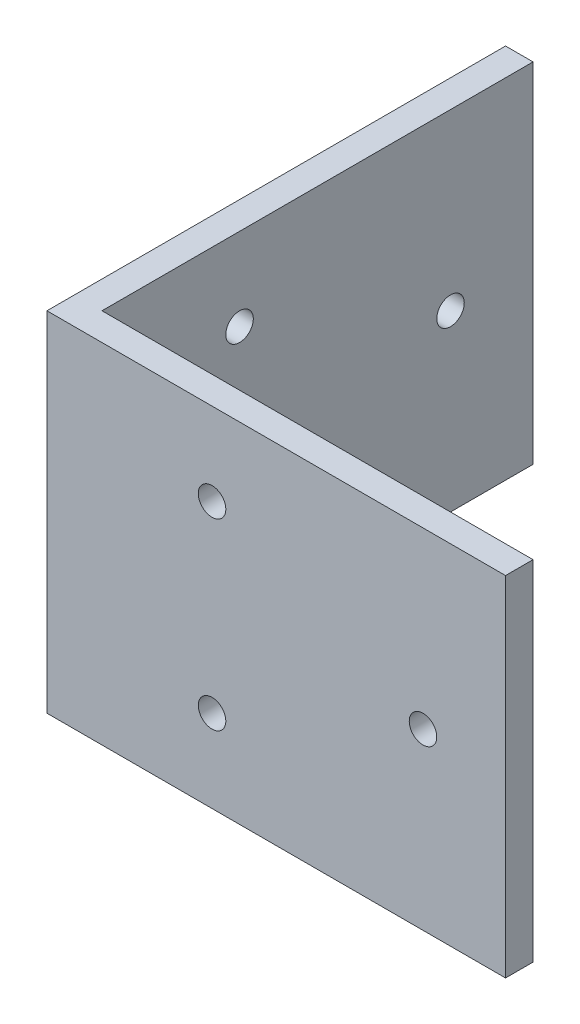
ISO-10303-21;
HEADER;
FILE_DESCRIPTION(('STEP AP214'),'2;1');
FILE_NAME('part.step','',(''),(''),'','','');
FILE_SCHEMA(('AUTOMOTIVE_DESIGN { 1 0 10303 214 1 1 1 1 }'));
ENDSEC;
DATA;
#1=APPLICATION_CONTEXT('core data for automotive mechanical design processes');
#2=APPLICATION_PROTOCOL_DEFINITION('international standard','automotive_design',2000,#1);
#3=PRODUCT_CONTEXT('',#1,'mechanical');
#4=PRODUCT('Part','Part','',(#3));
#5=PRODUCT_RELATED_PRODUCT_CATEGORY('part','',(#4));
#6=PRODUCT_DEFINITION_FORMATION('','',#4);
#7=PRODUCT_DEFINITION_CONTEXT('part definition',#1,'design');
#8=PRODUCT_DEFINITION('design','',#6,#7);
#9=PRODUCT_DEFINITION_SHAPE('','',#8);
#10=(LENGTH_UNIT() NAMED_UNIT(*) SI_UNIT(.MILLI.,.METRE.));
#11=(NAMED_UNIT(*) PLANE_ANGLE_UNIT() SI_UNIT($,.RADIAN.));
#12=(NAMED_UNIT(*) SI_UNIT($,.STERADIAN.) SOLID_ANGLE_UNIT());
#13=UNCERTAINTY_MEASURE_WITH_UNIT(LENGTH_MEASURE(1.E-05),#10,'distance_accuracy_value','');
#14=(GEOMETRIC_REPRESENTATION_CONTEXT(3) GLOBAL_UNCERTAINTY_ASSIGNED_CONTEXT((#13)) GLOBAL_UNIT_ASSIGNED_CONTEXT((#10,
#11,#12)) REPRESENTATION_CONTEXT('',''));
#15=CARTESIAN_POINT('',(0.,0.,0.));
#16=DIRECTION('',(0.,0.,1.));
#17=DIRECTION('',(1.,0.,0.));
#18=AXIS2_PLACEMENT_3D('',#15,#16,#17);
#19=CARTESIAN_POINT('',(3.,38.,0.));
#20=DIRECTION('',(0.,0.,1.));
#21=DIRECTION('',(1.,0.,0.));
#22=AXIS2_PLACEMENT_3D('',#19,#20,#21);
#23=PLANE('',#22);
#24=DIRECTION('',(-1.,0.,0.));
#25=VECTOR('',#24,1.);
#26=CARTESIAN_POINT('',(3.,0.,0.));
#27=LINE('',#26,#25);
#28=CARTESIAN_POINT('',(3.,0.,0.));
#29=VERTEX_POINT('',#28);
#30=CARTESIAN_POINT('',(0.,0.,0.));
#31=VERTEX_POINT('',#30);
#32=EDGE_CURVE('E118',#29,#31,#27,.T.);
#33=ORIENTED_EDGE('',*,*,#32,.T.);
#34=DIRECTION('',(0.,-1.,0.));
#35=VECTOR('',#34,1.);
#36=CARTESIAN_POINT('',(0.,38.,0.));
#37=LINE('',#36,#35);
#38=CARTESIAN_POINT('',(0.,38.,0.));
#39=VERTEX_POINT('',#38);
#40=EDGE_CURVE('E11',#39,#31,#37,.T.);
#41=ORIENTED_EDGE('',*,*,#40,.F.);
#42=DIRECTION('',(-1.,0.,0.));
#43=VECTOR('',#42,1.);
#44=CARTESIAN_POINT('',(3.,38.,0.));
#45=LINE('',#44,#43);
#46=CARTESIAN_POINT('',(3.,38.,0.));
#47=VERTEX_POINT('',#46);
#48=EDGE_CURVE('E129',#47,#39,#45,.T.);
#49=ORIENTED_EDGE('',*,*,#48,.F.);
#50=DIRECTION('',(0.,-1.,0.));
#51=VECTOR('',#50,1.);
#52=CARTESIAN_POINT('',(3.,38.,0.));
#53=LINE('',#52,#51);
#54=EDGE_CURVE('E114',#47,#29,#53,.T.);
#55=ORIENTED_EDGE('',*,*,#54,.T.);
#56=EDGE_LOOP('',(#33,#41,#49,#55));
#57=FACE_BOUND('',#56,.T.);
#58=ADVANCED_FACE('F34',(#57),#23,.F.);
#59=CARTESIAN_POINT('',(0.,38.,0.));
#60=DIRECTION('',(1.,0.,0.));
#61=DIRECTION('',(0.,0.,-1.));
#62=AXIS2_PLACEMENT_3D('',#59,#60,#61);
#63=PLANE('',#62);
#64=CARTESIAN_POINT('',(0.,19.,9.00000000000001));
#65=DIRECTION('',(1.,0.,0.));
#66=DIRECTION('',(0.,0.,-1.));
#67=AXIS2_PLACEMENT_3D('',#64,#65,#66);
#68=CIRCLE('',#67,1.5);
#69=CARTESIAN_POINT('',(0.,19.,7.50000000000001));
#70=VERTEX_POINT('',#69);
#71=EDGE_CURVE('E294',#70,#70,#68,.T.);
#72=ORIENTED_EDGE('',*,*,#71,.T.);
#73=EDGE_LOOP('',(#72));
#74=FACE_BOUND('',#73,.T.);
#75=CARTESIAN_POINT('',(0.,9.,32.));
#76=DIRECTION('',(1.,0.,0.));
#77=DIRECTION('',(0.,0.,-1.));
#78=AXIS2_PLACEMENT_3D('',#75,#76,#77);
#79=CIRCLE('',#78,1.5);
#80=CARTESIAN_POINT('',(0.,9.,30.5));
#81=VERTEX_POINT('',#80);
#82=EDGE_CURVE('E284',#81,#81,#79,.T.);
#83=ORIENTED_EDGE('',*,*,#82,.T.);
#84=EDGE_LOOP('',(#83));
#85=FACE_BOUND('',#84,.T.);
#86=CARTESIAN_POINT('',(0.,29.,32.));
#87=DIRECTION('',(1.,0.,0.));
#88=DIRECTION('',(0.,0.,-1.));
#89=AXIS2_PLACEMENT_3D('',#86,#87,#88);
#90=CIRCLE('',#89,1.5);
#91=CARTESIAN_POINT('',(0.,29.,30.5));
#92=VERTEX_POINT('',#91);
#93=EDGE_CURVE('E122',#92,#92,#90,.T.);
#94=ORIENTED_EDGE('',*,*,#93,.T.);
#95=EDGE_LOOP('',(#94));
#96=FACE_BOUND('',#95,.T.);
#97=DIRECTION('',(0.,0.,1.));
#98=VECTOR('',#97,1.);
#99=CARTESIAN_POINT('',(0.,0.,0.));
#100=LINE('',#99,#98);
#101=CARTESIAN_POINT('',(0.,0.,50.));
#102=VERTEX_POINT('',#101);
#103=EDGE_CURVE('E121',#31,#102,#100,.T.);
#104=ORIENTED_EDGE('',*,*,#103,.T.);
#105=DIRECTION('',(0.,-1.,0.));
#106=VECTOR('',#105,1.);
#107=CARTESIAN_POINT('',(0.,38.,50.));
#108=LINE('',#107,#106);
#109=CARTESIAN_POINT('',(0.,38.,50.));
#110=VERTEX_POINT('',#109);
#111=EDGE_CURVE('E42',#110,#102,#108,.T.);
#112=ORIENTED_EDGE('',*,*,#111,.F.);
#113=DIRECTION('',(0.,0.,1.));
#114=VECTOR('',#113,1.);
#115=CARTESIAN_POINT('',(0.,38.,0.));
#116=LINE('',#115,#114);
#117=EDGE_CURVE('E87',#39,#110,#116,.T.);
#118=ORIENTED_EDGE('',*,*,#117,.F.);
#119=ORIENTED_EDGE('',*,*,#40,.T.);
#120=EDGE_LOOP('',(#104,#112,#118,#119));
#121=FACE_BOUND('',#120,.T.);
#122=ADVANCED_FACE('F157',(#74,#85,#96,#121),#63,.F.);
#123=CARTESIAN_POINT('',(0.,38.,50.));
#124=DIRECTION('',(0.,0.,-1.));
#125=DIRECTION('',(-1.,0.,0.));
#126=AXIS2_PLACEMENT_3D('',#123,#124,#125);
#127=PLANE('',#126);
#128=CARTESIAN_POINT('',(41.,19.,50.));
#129=DIRECTION('',(0.,0.,-1.));
#130=DIRECTION('',(-1.,0.,0.));
#131=AXIS2_PLACEMENT_3D('',#128,#129,#130);
#132=CIRCLE('',#131,1.5);
#133=CARTESIAN_POINT('',(39.5,19.,50.));
#134=VERTEX_POINT('',#133);
#135=EDGE_CURVE('E311',#134,#134,#132,.T.);
#136=ORIENTED_EDGE('',*,*,#135,.T.);
#137=EDGE_LOOP('',(#136));
#138=FACE_BOUND('',#137,.T.);
#139=CARTESIAN_POINT('',(18.,9.,50.));
#140=DIRECTION('',(0.,0.,-1.));
#141=DIRECTION('',(-1.,0.,0.));
#142=AXIS2_PLACEMENT_3D('',#139,#140,#141);
#143=CIRCLE('',#142,1.5);
#144=CARTESIAN_POINT('',(16.5,9.,50.));
#145=VERTEX_POINT('',#144);
#146=EDGE_CURVE('E305',#145,#145,#143,.T.);
#147=ORIENTED_EDGE('',*,*,#146,.T.);
#148=EDGE_LOOP('',(#147));
#149=FACE_BOUND('',#148,.T.);
#150=CARTESIAN_POINT('',(18.,29.,50.));
#151=DIRECTION('',(0.,0.,-1.));
#152=DIRECTION('',(-1.,0.,0.));
#153=AXIS2_PLACEMENT_3D('',#150,#151,#152);
#154=CIRCLE('',#153,1.5);
#155=CARTESIAN_POINT('',(16.5,29.,50.));
#156=VERTEX_POINT('',#155);
#157=EDGE_CURVE('E299',#156,#156,#154,.T.);
#158=ORIENTED_EDGE('',*,*,#157,.T.);
#159=EDGE_LOOP('',(#158));
#160=FACE_BOUND('',#159,.T.);
#161=DIRECTION('',(1.,0.,0.));
#162=VECTOR('',#161,1.);
#163=CARTESIAN_POINT('',(0.,0.,50.));
#164=LINE('',#163,#162);
#165=CARTESIAN_POINT('',(50.,0.,50.));
#166=VERTEX_POINT('',#165);
#167=EDGE_CURVE('E124',#102,#166,#164,.T.);
#168=ORIENTED_EDGE('',*,*,#167,.T.);
#169=DIRECTION('',(0.,-1.,0.));
#170=VECTOR('',#169,1.);
#171=CARTESIAN_POINT('',(50.,38.,50.));
#172=LINE('',#171,#170);
#173=CARTESIAN_POINT('',(50.,38.,50.));
#174=VERTEX_POINT('',#173);
#175=EDGE_CURVE('E109',#174,#166,#172,.T.);
#176=ORIENTED_EDGE('',*,*,#175,.F.);
#177=DIRECTION('',(1.,0.,0.));
#178=VECTOR('',#177,1.);
#179=CARTESIAN_POINT('',(0.,38.,50.));
#180=LINE('',#179,#178);
#181=EDGE_CURVE('E100',#110,#174,#180,.T.);
#182=ORIENTED_EDGE('',*,*,#181,.F.);
#183=ORIENTED_EDGE('',*,*,#111,.T.);
#184=EDGE_LOOP('',(#168,#176,#182,#183));
#185=FACE_BOUND('',#184,.T.);
#186=ADVANCED_FACE('F135',(#138,#149,#160,#185),#127,.F.);
#187=CARTESIAN_POINT('',(50.,38.,50.));
#188=DIRECTION('',(-1.,0.,0.));
#189=DIRECTION('',(0.,0.,1.));
#190=AXIS2_PLACEMENT_3D('',#187,#188,#189);
#191=PLANE('',#190);
#192=DIRECTION('',(0.,0.,-1.));
#193=VECTOR('',#192,1.);
#194=CARTESIAN_POINT('',(50.,0.,50.));
#195=LINE('',#194,#193);
#196=CARTESIAN_POINT('',(50.,0.,47.));
#197=VERTEX_POINT('',#196);
#198=EDGE_CURVE('E108',#166,#197,#195,.T.);
#199=ORIENTED_EDGE('',*,*,#198,.T.);
#200=DIRECTION('',(0.,-1.,0.));
#201=VECTOR('',#200,1.);
#202=CARTESIAN_POINT('',(50.,38.,47.));
#203=LINE('',#202,#201);
#204=CARTESIAN_POINT('',(50.,38.,47.));
#205=VERTEX_POINT('',#204);
#206=EDGE_CURVE('E105',#205,#197,#203,.T.);
#207=ORIENTED_EDGE('',*,*,#206,.F.);
#208=DIRECTION('',(0.,0.,-1.));
#209=VECTOR('',#208,1.);
#210=CARTESIAN_POINT('',(50.,38.,50.));
#211=LINE('',#210,#209);
#212=EDGE_CURVE('E94',#174,#205,#211,.T.);
#213=ORIENTED_EDGE('',*,*,#212,.F.);
#214=ORIENTED_EDGE('',*,*,#175,.T.);
#215=EDGE_LOOP('',(#199,#207,#213,#214));
#216=FACE_BOUND('',#215,.T.);
#217=ADVANCED_FACE('F106',(#216),#191,.F.);
#218=CARTESIAN_POINT('',(50.,38.,47.));
#219=DIRECTION('',(0.,0.,1.));
#220=DIRECTION('',(1.,0.,0.));
#221=AXIS2_PLACEMENT_3D('',#218,#219,#220);
#222=PLANE('',#221);
#223=CARTESIAN_POINT('',(41.,19.,47.));
#224=DIRECTION('',(0.,0.,-1.));
#225=DIRECTION('',(-1.,0.,0.));
#226=AXIS2_PLACEMENT_3D('',#223,#224,#225);
#227=CIRCLE('',#226,1.5);
#228=CARTESIAN_POINT('',(39.5,19.,47.));
#229=VERTEX_POINT('',#228);
#230=EDGE_CURVE('E314',#229,#229,#227,.T.);
#231=ORIENTED_EDGE('',*,*,#230,.F.);
#232=EDGE_LOOP('',(#231));
#233=FACE_BOUND('',#232,.T.);
#234=CARTESIAN_POINT('',(18.,9.,47.));
#235=DIRECTION('',(0.,0.,-1.));
#236=DIRECTION('',(-1.,0.,0.));
#237=AXIS2_PLACEMENT_3D('',#234,#235,#236);
#238=CIRCLE('',#237,1.5);
#239=CARTESIAN_POINT('',(16.5,9.,47.));
#240=VERTEX_POINT('',#239);
#241=EDGE_CURVE('E308',#240,#240,#238,.T.);
#242=ORIENTED_EDGE('',*,*,#241,.F.);
#243=EDGE_LOOP('',(#242));
#244=FACE_BOUND('',#243,.T.);
#245=CARTESIAN_POINT('',(18.,29.,47.));
#246=DIRECTION('',(0.,0.,-1.));
#247=DIRECTION('',(-1.,0.,0.));
#248=AXIS2_PLACEMENT_3D('',#245,#246,#247);
#249=CIRCLE('',#248,1.5);
#250=CARTESIAN_POINT('',(16.5,29.,47.));
#251=VERTEX_POINT('',#250);
#252=EDGE_CURVE('E302',#251,#251,#249,.T.);
#253=ORIENTED_EDGE('',*,*,#252,.F.);
#254=EDGE_LOOP('',(#253));
#255=FACE_BOUND('',#254,.T.);
#256=DIRECTION('',(-1.,0.,0.));
#257=VECTOR('',#256,1.);
#258=CARTESIAN_POINT('',(50.,0.,47.));
#259=LINE('',#258,#257);
#260=CARTESIAN_POINT('',(3.,0.,47.));
#261=VERTEX_POINT('',#260);
#262=EDGE_CURVE('E73',#197,#261,#259,.T.);
#263=ORIENTED_EDGE('',*,*,#262,.T.);
#264=DIRECTION('',(0.,-1.,0.));
#265=VECTOR('',#264,1.);
#266=CARTESIAN_POINT('',(3.,38.,47.));
#267=LINE('',#266,#265);
#268=CARTESIAN_POINT('',(3.,38.,47.));
#269=VERTEX_POINT('',#268);
#270=EDGE_CURVE('E110',#269,#261,#267,.T.);
#271=ORIENTED_EDGE('',*,*,#270,.F.);
#272=DIRECTION('',(-1.,0.,0.));
#273=VECTOR('',#272,1.);
#274=CARTESIAN_POINT('',(50.,38.,47.));
#275=LINE('',#274,#273);
#276=EDGE_CURVE('E98',#205,#269,#275,.T.);
#277=ORIENTED_EDGE('',*,*,#276,.F.);
#278=ORIENTED_EDGE('',*,*,#206,.T.);
#279=EDGE_LOOP('',(#263,#271,#277,#278));
#280=FACE_BOUND('',#279,.T.);
#281=ADVANCED_FACE('F112',(#233,#244,#255,#280),#222,.F.);
#282=CARTESIAN_POINT('',(3.,38.,47.));
#283=DIRECTION('',(-1.,0.,0.));
#284=DIRECTION('',(0.,0.,1.));
#285=AXIS2_PLACEMENT_3D('',#282,#283,#284);
#286=PLANE('',#285);
#287=CARTESIAN_POINT('',(3.,19.,9.00000000000001));
#288=DIRECTION('',(1.,0.,0.));
#289=DIRECTION('',(0.,0.,-1.));
#290=AXIS2_PLACEMENT_3D('',#287,#288,#289);
#291=CIRCLE('',#290,1.5);
#292=CARTESIAN_POINT('',(3.,19.,7.50000000000001));
#293=VERTEX_POINT('',#292);
#294=EDGE_CURVE('E296',#293,#293,#291,.T.);
#295=ORIENTED_EDGE('',*,*,#294,.F.);
#296=EDGE_LOOP('',(#295));
#297=FACE_BOUND('',#296,.T.);
#298=CARTESIAN_POINT('',(3.,9.,32.));
#299=DIRECTION('',(1.,0.,0.));
#300=DIRECTION('',(0.,0.,-1.));
#301=AXIS2_PLACEMENT_3D('',#298,#299,#300);
#302=CIRCLE('',#301,1.5);
#303=CARTESIAN_POINT('',(3.,9.,30.5));
#304=VERTEX_POINT('',#303);
#305=EDGE_CURVE('E291',#304,#304,#302,.T.);
#306=ORIENTED_EDGE('',*,*,#305,.F.);
#307=EDGE_LOOP('',(#306));
#308=FACE_BOUND('',#307,.T.);
#309=CARTESIAN_POINT('',(3.,29.,32.));
#310=DIRECTION('',(1.,0.,0.));
#311=DIRECTION('',(0.,0.,-1.));
#312=AXIS2_PLACEMENT_3D('',#309,#310,#311);
#313=CIRCLE('',#312,1.5);
#314=CARTESIAN_POINT('',(3.,29.,30.5));
#315=VERTEX_POINT('',#314);
#316=EDGE_CURVE('E279',#315,#315,#313,.T.);
#317=ORIENTED_EDGE('',*,*,#316,.F.);
#318=EDGE_LOOP('',(#317));
#319=FACE_BOUND('',#318,.T.);
#320=DIRECTION('',(0.,0.,-1.));
#321=VECTOR('',#320,1.);
#322=CARTESIAN_POINT('',(3.,0.,47.));
#323=LINE('',#322,#321);
#324=EDGE_CURVE('E79',#261,#29,#323,.T.);
#325=ORIENTED_EDGE('',*,*,#324,.T.);
#326=ORIENTED_EDGE('',*,*,#54,.F.);
#327=DIRECTION('',(0.,0.,-1.));
#328=VECTOR('',#327,1.);
#329=CARTESIAN_POINT('',(3.,38.,47.));
#330=LINE('',#329,#328);
#331=EDGE_CURVE('E50',#269,#47,#330,.T.);
#332=ORIENTED_EDGE('',*,*,#331,.F.);
#333=ORIENTED_EDGE('',*,*,#270,.T.);
#334=EDGE_LOOP('',(#325,#326,#332,#333));
#335=FACE_BOUND('',#334,.T.);
#336=ADVANCED_FACE('F142',(#297,#308,#319,#335),#286,.F.);
#337=CARTESIAN_POINT('',(0.,38.,0.));
#338=DIRECTION('',(0.,1.,0.));
#339=DIRECTION('',(0.,0.,1.));
#340=AXIS2_PLACEMENT_3D('',#337,#338,#339);
#341=PLANE('',#340);
#342=ORIENTED_EDGE('',*,*,#48,.T.);
#343=ORIENTED_EDGE('',*,*,#117,.T.);
#344=ORIENTED_EDGE('',*,*,#181,.T.);
#345=ORIENTED_EDGE('',*,*,#212,.T.);
#346=ORIENTED_EDGE('',*,*,#276,.T.);
#347=ORIENTED_EDGE('',*,*,#331,.T.);
#348=EDGE_LOOP('',(#342,#343,#344,#345,#346,#347));
#349=FACE_BOUND('',#348,.T.);
#350=ADVANCED_FACE('F96',(#349),#341,.T.);
#351=CARTESIAN_POINT('',(0.,0.,0.));
#352=DIRECTION('',(0.,1.,0.));
#353=DIRECTION('',(0.,0.,1.));
#354=AXIS2_PLACEMENT_3D('',#351,#352,#353);
#355=PLANE('',#354);
#356=ORIENTED_EDGE('',*,*,#32,.F.);
#357=ORIENTED_EDGE('',*,*,#324,.F.);
#358=ORIENTED_EDGE('',*,*,#262,.F.);
#359=ORIENTED_EDGE('',*,*,#198,.F.);
#360=ORIENTED_EDGE('',*,*,#167,.F.);
#361=ORIENTED_EDGE('',*,*,#103,.F.);
#362=EDGE_LOOP('',(#356,#357,#358,#359,#360,#361));
#363=FACE_BOUND('',#362,.T.);
#364=ADVANCED_FACE('F138',(#363),#355,.F.);
#365=CARTESIAN_POINT('',(-47.,29.,32.));
#366=DIRECTION('',(1.,0.,0.));
#367=DIRECTION('',(0.,0.,-1.));
#368=AXIS2_PLACEMENT_3D('',#365,#366,#367);
#369=CYLINDRICAL_SURFACE('',#368,1.5);
#370=ORIENTED_EDGE('',*,*,#316,.T.);
#371=EDGE_LOOP('',(#370));
#372=FACE_BOUND('',#371,.T.);
#373=ORIENTED_EDGE('',*,*,#93,.F.);
#374=EDGE_LOOP('',(#373));
#375=FACE_BOUND('',#374,.T.);
#376=ADVANCED_FACE('F229',(#372,#375),#369,.F.);
#377=CARTESIAN_POINT('',(-47.,9.,32.));
#378=DIRECTION('',(1.,0.,0.));
#379=DIRECTION('',(0.,0.,-1.));
#380=AXIS2_PLACEMENT_3D('',#377,#378,#379);
#381=CYLINDRICAL_SURFACE('',#380,1.5);
#382=ORIENTED_EDGE('',*,*,#305,.T.);
#383=EDGE_LOOP('',(#382));
#384=FACE_BOUND('',#383,.T.);
#385=ORIENTED_EDGE('',*,*,#82,.F.);
#386=EDGE_LOOP('',(#385));
#387=FACE_BOUND('',#386,.T.);
#388=ADVANCED_FACE('F225',(#384,#387),#381,.F.);
#389=CARTESIAN_POINT('',(-47.,19.,9.00000000000001));
#390=DIRECTION('',(1.,0.,0.));
#391=DIRECTION('',(0.,0.,-1.));
#392=AXIS2_PLACEMENT_3D('',#389,#390,#391);
#393=CYLINDRICAL_SURFACE('',#392,1.5);
#394=ORIENTED_EDGE('',*,*,#294,.T.);
#395=EDGE_LOOP('',(#394));
#396=FACE_BOUND('',#395,.T.);
#397=ORIENTED_EDGE('',*,*,#71,.F.);
#398=EDGE_LOOP('',(#397));
#399=FACE_BOUND('',#398,.T.);
#400=ADVANCED_FACE('F195',(#396,#399),#393,.F.);
#401=CARTESIAN_POINT('',(18.,29.,97.));
#402=DIRECTION('',(0.,0.,-1.));
#403=DIRECTION('',(-1.,0.,0.));
#404=AXIS2_PLACEMENT_3D('',#401,#402,#403);
#405=CYLINDRICAL_SURFACE('',#404,1.5);
#406=ORIENTED_EDGE('',*,*,#252,.T.);
#407=EDGE_LOOP('',(#406));
#408=FACE_BOUND('',#407,.T.);
#409=ORIENTED_EDGE('',*,*,#157,.F.);
#410=EDGE_LOOP('',(#409));
#411=FACE_BOUND('',#410,.T.);
#412=ADVANCED_FACE('F189',(#408,#411),#405,.F.);
#413=CARTESIAN_POINT('',(18.,9.,97.));
#414=DIRECTION('',(0.,0.,-1.));
#415=DIRECTION('',(-1.,0.,0.));
#416=AXIS2_PLACEMENT_3D('',#413,#414,#415);
#417=CYLINDRICAL_SURFACE('',#416,1.5);
#418=ORIENTED_EDGE('',*,*,#241,.T.);
#419=EDGE_LOOP('',(#418));
#420=FACE_BOUND('',#419,.T.);
#421=ORIENTED_EDGE('',*,*,#146,.F.);
#422=EDGE_LOOP('',(#421));
#423=FACE_BOUND('',#422,.T.);
#424=ADVANCED_FACE('F194',(#420,#423),#417,.F.);
#425=CARTESIAN_POINT('',(41.,19.,97.));
#426=DIRECTION('',(0.,0.,-1.));
#427=DIRECTION('',(-1.,0.,0.));
#428=AXIS2_PLACEMENT_3D('',#425,#426,#427);
#429=CYLINDRICAL_SURFACE('',#428,1.5);
#430=ORIENTED_EDGE('',*,*,#230,.T.);
#431=EDGE_LOOP('',(#430));
#432=FACE_BOUND('',#431,.T.);
#433=ORIENTED_EDGE('',*,*,#135,.F.);
#434=EDGE_LOOP('',(#433));
#435=FACE_BOUND('',#434,.T.);
#436=ADVANCED_FACE('F207',(#432,#435),#429,.F.);
#437=CLOSED_SHELL('',(#58,#122,#186,#217,#281,#336,#350,#364,#376,#388,#400,#412,#424,#436));
#438=MANIFOLD_SOLID_BREP('B2',#437);
#439=ADVANCED_BREP_SHAPE_REPRESENTATION('',(#18,#438),#14);
#440=SHAPE_DEFINITION_REPRESENTATION(#9,#439);
ENDSEC;
END-ISO-10303-21;
